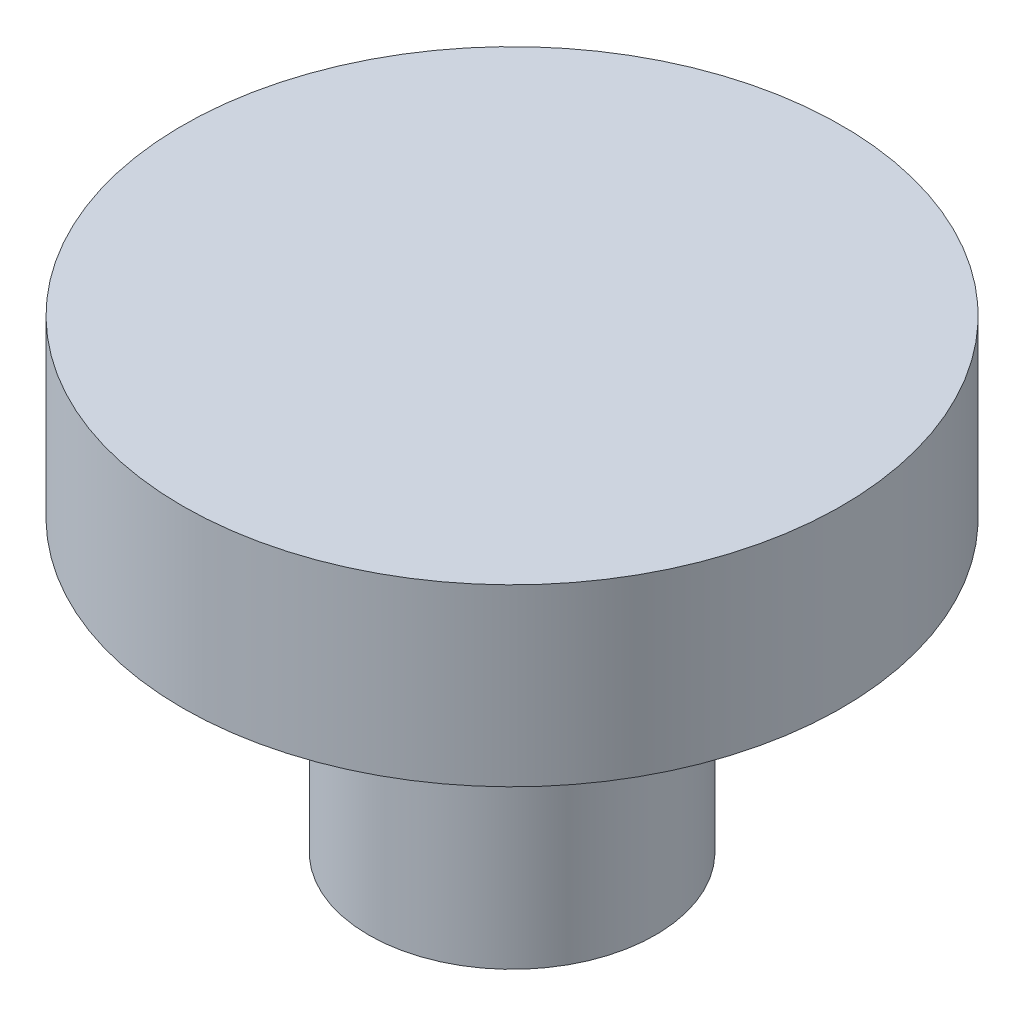
ISO-10303-21;
HEADER;
FILE_DESCRIPTION(('STEP AP214'),'2;1');
FILE_NAME('part.step','',(''),(''),'','','');
FILE_SCHEMA(('AUTOMOTIVE_DESIGN { 1 0 10303 214 1 1 1 1 }'));
ENDSEC;
DATA;
#1=APPLICATION_CONTEXT('core data for automotive mechanical design processes');
#2=APPLICATION_PROTOCOL_DEFINITION('international standard','automotive_design',2000,#1);
#3=PRODUCT_CONTEXT('',#1,'mechanical');
#4=PRODUCT('Part','Part','',(#3));
#5=PRODUCT_RELATED_PRODUCT_CATEGORY('part','',(#4));
#6=PRODUCT_DEFINITION_FORMATION('','',#4);
#7=PRODUCT_DEFINITION_CONTEXT('part definition',#1,'design');
#8=PRODUCT_DEFINITION('design','',#6,#7);
#9=PRODUCT_DEFINITION_SHAPE('','',#8);
#10=(LENGTH_UNIT() NAMED_UNIT(*) SI_UNIT(.MILLI.,.METRE.));
#11=(NAMED_UNIT(*) PLANE_ANGLE_UNIT() SI_UNIT($,.RADIAN.));
#12=(NAMED_UNIT(*) SI_UNIT($,.STERADIAN.) SOLID_ANGLE_UNIT());
#13=UNCERTAINTY_MEASURE_WITH_UNIT(LENGTH_MEASURE(1.E-05),#10,'distance_accuracy_value','');
#14=(GEOMETRIC_REPRESENTATION_CONTEXT(3) GLOBAL_UNCERTAINTY_ASSIGNED_CONTEXT((#13)) GLOBAL_UNIT_ASSIGNED_CONTEXT((#10,
#11,#12)) REPRESENTATION_CONTEXT('',''));
#15=CARTESIAN_POINT('',(0.,0.,0.));
#16=DIRECTION('',(0.,0.,1.));
#17=DIRECTION('',(1.,0.,0.));
#18=AXIS2_PLACEMENT_3D('',#15,#16,#17);
#19=CARTESIAN_POINT('',(0.,10.5156,0.));
#20=DIRECTION('',(0.,-1.,0.));
#21=DIRECTION('',(0.,0.,-1.));
#22=AXIS2_PLACEMENT_3D('',#19,#20,#21);
#23=CYLINDRICAL_SURFACE('',#22,5.207);
#24=CARTESIAN_POINT('',(0.,10.5156,0.));
#25=DIRECTION('',(0.,1.,0.));
#26=DIRECTION('',(0.,0.,1.));
#27=AXIS2_PLACEMENT_3D('',#24,#25,#26);
#28=CIRCLE('',#27,5.207);
#29=CARTESIAN_POINT('',(0.,10.5156,5.207));
#30=VERTEX_POINT('',#29);
#31=EDGE_CURVE('E10',#30,#30,#28,.T.);
#32=ORIENTED_EDGE('',*,*,#31,.F.);
#33=EDGE_LOOP('',(#32));
#34=FACE_BOUND('',#33,.T.);
#35=CARTESIAN_POINT('',(0.,0.,0.));
#36=DIRECTION('',(0.,1.,0.));
#37=DIRECTION('',(0.,0.,1.));
#38=AXIS2_PLACEMENT_3D('',#35,#36,#37);
#39=CIRCLE('',#38,5.207);
#40=CARTESIAN_POINT('',(0.,0.,5.207));
#41=VERTEX_POINT('',#40);
#42=EDGE_CURVE('E40',#41,#41,#39,.T.);
#43=ORIENTED_EDGE('',*,*,#42,.T.);
#44=EDGE_LOOP('',(#43));
#45=FACE_BOUND('',#44,.T.);
#46=ADVANCED_FACE('F37',(#34,#45),#23,.T.);
#47=CARTESIAN_POINT('',(0.,0.,0.));
#48=DIRECTION('',(0.,1.,0.));
#49=DIRECTION('',(0.,0.,1.));
#50=AXIS2_PLACEMENT_3D('',#47,#48,#49);
#51=PLANE('',#50);
#52=ORIENTED_EDGE('',*,*,#42,.F.);
#53=EDGE_LOOP('',(#52));
#54=FACE_BOUND('',#53,.T.);
#55=ADVANCED_FACE('F64',(#54),#51,.F.);
#56=CARTESIAN_POINT('',(0.,16.8656,0.));
#57=DIRECTION('',(0.,-1.,0.));
#58=DIRECTION('',(0.,0.,-1.));
#59=AXIS2_PLACEMENT_3D('',#56,#57,#58);
#60=CYLINDRICAL_SURFACE('',#59,11.9634);
#61=CARTESIAN_POINT('',(0.,16.8656,0.));
#62=DIRECTION('',(0.,1.,0.));
#63=DIRECTION('',(0.,0.,1.));
#64=AXIS2_PLACEMENT_3D('',#61,#62,#63);
#65=CIRCLE('',#64,11.9634);
#66=CARTESIAN_POINT('',(0.,16.8656,11.9634));
#67=VERTEX_POINT('',#66);
#68=EDGE_CURVE('E49',#67,#67,#65,.T.);
#69=ORIENTED_EDGE('',*,*,#68,.F.);
#70=EDGE_LOOP('',(#69));
#71=FACE_BOUND('',#70,.T.);
#72=CARTESIAN_POINT('',(0.,10.5156,0.));
#73=DIRECTION('',(0.,1.,0.));
#74=DIRECTION('',(0.,0.,1.));
#75=AXIS2_PLACEMENT_3D('',#72,#73,#74);
#76=CIRCLE('',#75,11.9634);
#77=CARTESIAN_POINT('',(0.,10.5156,11.9634));
#78=VERTEX_POINT('',#77);
#79=EDGE_CURVE('E51',#78,#78,#76,.T.);
#80=ORIENTED_EDGE('',*,*,#79,.T.);
#81=EDGE_LOOP('',(#80));
#82=FACE_BOUND('',#81,.T.);
#83=ADVANCED_FACE('F61',(#71,#82),#60,.T.);
#84=CARTESIAN_POINT('',(0.,16.8656,0.));
#85=DIRECTION('',(0.,1.,0.));
#86=DIRECTION('',(0.,0.,1.));
#87=AXIS2_PLACEMENT_3D('',#84,#85,#86);
#88=PLANE('',#87);
#89=ORIENTED_EDGE('',*,*,#68,.T.);
#90=EDGE_LOOP('',(#89));
#91=FACE_BOUND('',#90,.T.);
#92=ADVANCED_FACE('F59',(#91),#88,.T.);
#93=CARTESIAN_POINT('',(0.,10.5156,0.));
#94=DIRECTION('',(0.,1.,0.));
#95=DIRECTION('',(0.,0.,1.));
#96=AXIS2_PLACEMENT_3D('',#93,#94,#95);
#97=PLANE('',#96);
#98=ORIENTED_EDGE('',*,*,#31,.T.);
#99=EDGE_LOOP('',(#98));
#100=FACE_BOUND('',#99,.T.);
#101=ORIENTED_EDGE('',*,*,#79,.F.);
#102=EDGE_LOOP('',(#101));
#103=FACE_BOUND('',#102,.T.);
#104=ADVANCED_FACE('F68',(#100,#103),#97,.F.);
#105=CLOSED_SHELL('',(#46,#55,#83,#92,#104));
#106=MANIFOLD_SOLID_BREP('B2',#105);
#107=ADVANCED_BREP_SHAPE_REPRESENTATION('',(#18,#106),#14);
#108=SHAPE_DEFINITION_REPRESENTATION(#9,#107);
ENDSEC;
END-ISO-10303-21;
